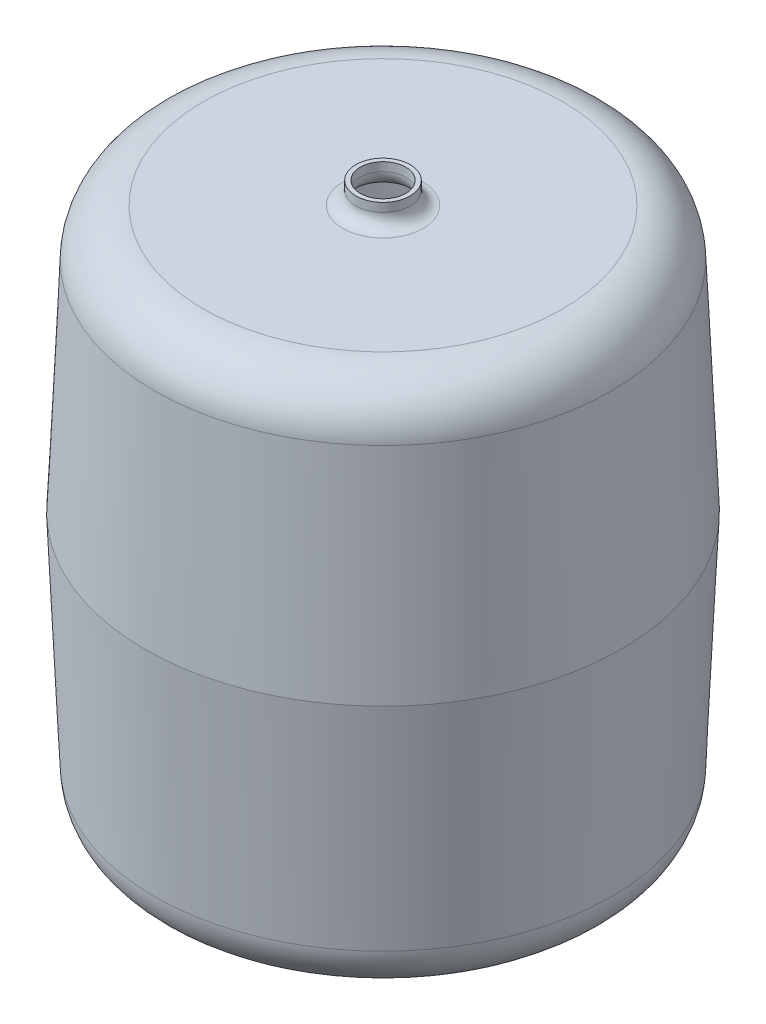
ISO-10303-21;
HEADER;
FILE_DESCRIPTION(('STEP AP214'),'2;1');
FILE_NAME('part.step','',(''),(''),'','','');
FILE_SCHEMA(('AUTOMOTIVE_DESIGN { 1 0 10303 214 1 1 1 1 }'));
ENDSEC;
DATA;
#1=APPLICATION_CONTEXT('core data for automotive mechanical design processes');
#2=APPLICATION_PROTOCOL_DEFINITION('international standard','automotive_design',2000,#1);
#3=PRODUCT_CONTEXT('',#1,'mechanical');
#4=PRODUCT('Part','Part','',(#3));
#5=PRODUCT_RELATED_PRODUCT_CATEGORY('part','',(#4));
#6=PRODUCT_DEFINITION_FORMATION('','',#4);
#7=PRODUCT_DEFINITION_CONTEXT('part definition',#1,'design');
#8=PRODUCT_DEFINITION('design','',#6,#7);
#9=PRODUCT_DEFINITION_SHAPE('','',#8);
#10=(LENGTH_UNIT() NAMED_UNIT(*) SI_UNIT(.MILLI.,.METRE.));
#11=(NAMED_UNIT(*) PLANE_ANGLE_UNIT() SI_UNIT($,.RADIAN.));
#12=(NAMED_UNIT(*) SI_UNIT($,.STERADIAN.) SOLID_ANGLE_UNIT());
#13=UNCERTAINTY_MEASURE_WITH_UNIT(LENGTH_MEASURE(1.E-05),#10,'distance_accuracy_value','');
#14=(GEOMETRIC_REPRESENTATION_CONTEXT(3) GLOBAL_UNCERTAINTY_ASSIGNED_CONTEXT((#13)) GLOBAL_UNIT_ASSIGNED_CONTEXT((#10,
#11,#12)) REPRESENTATION_CONTEXT('',''));
#15=CARTESIAN_POINT('',(0.,0.,0.));
#16=DIRECTION('',(0.,0.,1.));
#17=DIRECTION('',(1.,0.,0.));
#18=AXIS2_PLACEMENT_3D('',#15,#16,#17);
#19=CARTESIAN_POINT('',(1.13094262137405,254.067389771066,0.));
#20=DIRECTION('',(0.,-1.,0.));
#21=DIRECTION('',(0.,0.,-1.));
#22=AXIS2_PLACEMENT_3D('',#19,#20,#21);
#23=PLANE('',#22);
#24=CARTESIAN_POINT('',(26.1309426213741,254.067389771066,0.));
#25=DIRECTION('',(0.,-1.,0.));
#26=DIRECTION('',(0.,0.,-1.));
#27=AXIS2_PLACEMENT_3D('',#24,#25,#26);
#28=CIRCLE('',#27,21.);
#29=CARTESIAN_POINT('',(26.1309426213741,254.067389771066,-21.));
#30=VERTEX_POINT('',#29);
#31=EDGE_CURVE('E86',#30,#30,#28,.T.);
#32=ORIENTED_EDGE('',*,*,#31,.T.);
#33=EDGE_LOOP('',(#32));
#34=FACE_BOUND('',#33,.T.);
#35=CARTESIAN_POINT('',(26.1309426213741,254.067389771066,0.));
#36=DIRECTION('',(0.,-1.,0.));
#37=DIRECTION('',(0.,0.,-1.));
#38=AXIS2_PLACEMENT_3D('',#35,#36,#37);
#39=CIRCLE('',#38,25.);
#40=CARTESIAN_POINT('',(26.1309426213741,254.067389771066,-25.));
#41=VERTEX_POINT('',#40);
#42=EDGE_CURVE('E81',#41,#41,#39,.T.);
#43=ORIENTED_EDGE('',*,*,#42,.F.);
#44=EDGE_LOOP('',(#43));
#45=FACE_BOUND('',#44,.T.);
#46=ADVANCED_FACE('F45',(#34,#45),#23,.F.);
#47=CARTESIAN_POINT('',(-182.619057378626,-255.932610228934,0.));
#48=DIRECTION('',(0.,1.,0.));
#49=DIRECTION('',(0.,0.,1.));
#50=AXIS2_PLACEMENT_3D('',#47,#48,#49);
#51=PLANE('',#50);
#52=CARTESIAN_POINT('',(26.1309426213741,-255.932610228934,0.));
#53=DIRECTION('',(0.,1.,0.));
#54=DIRECTION('',(0.,0.,1.));
#55=AXIS2_PLACEMENT_3D('',#52,#53,#54);
#56=CIRCLE('',#55,165.671871598533);
#57=CARTESIAN_POINT('',(26.1309426213741,-255.932610228934,165.671871598533));
#58=VERTEX_POINT('',#57);
#59=EDGE_CURVE('E53',#58,#58,#56,.F.);
#60=ORIENTED_EDGE('',*,*,#59,.T.);
#61=EDGE_LOOP('',(#60));
#62=FACE_BOUND('',#61,.T.);
#63=ADVANCED_FACE('F134',(#62),#51,.F.);
#64=CARTESIAN_POINT('',(26.1309426213741,-10.9326102289342,0.));
#65=DIRECTION('',(0.,1.,0.));
#66=DIRECTION('',(0.,0.,1.));
#67=AXIS2_PLACEMENT_3D('',#64,#65,#66);
#68=CONICAL_SURFACE('',#67,219.446931012585,0.0436332312998548);
#69=CARTESIAN_POINT('',(26.1309426213741,-212.895482660374,0.));
#70=DIRECTION('',(0.,-1.,0.));
#71=DIRECTION('',(0.,0.,-1.));
#72=AXIS2_PLACEMENT_3D('',#69,#70,#71);
#73=CIRCLE('',#72,210.629041569717);
#74=CARTESIAN_POINT('',(26.1309426213741,-212.895482660374,-210.629041569717));
#75=VERTEX_POINT('',#74);
#76=EDGE_CURVE('E10',#75,#75,#73,.F.);
#77=ORIENTED_EDGE('',*,*,#76,.T.);
#78=EDGE_LOOP('',(#77));
#79=FACE_BOUND('',#78,.T.);
#80=CARTESIAN_POINT('',(26.1309426213741,-10.9326102289342,0.));
#81=DIRECTION('',(0.,-1.,0.));
#82=DIRECTION('',(0.,0.,-1.));
#83=AXIS2_PLACEMENT_3D('',#80,#81,#82);
#84=CIRCLE('',#83,219.446931012585);
#85=CARTESIAN_POINT('',(26.1309426213741,-10.9326102289342,-219.446931012585));
#86=VERTEX_POINT('',#85);
#87=EDGE_CURVE('E77',#86,#86,#84,.T.);
#88=ORIENTED_EDGE('',*,*,#87,.T.);
#89=EDGE_LOOP('',(#88));
#90=FACE_BOUND('',#89,.T.);
#91=ADVANCED_FACE('F140',(#79,#90),#68,.T.);
#92=CARTESIAN_POINT('',(26.1309426213741,234.067389771066,0.));
#93=DIRECTION('',(0.,-1.,0.));
#94=DIRECTION('',(0.,0.,-1.));
#95=AXIS2_PLACEMENT_3D('',#92,#93,#94);
#96=CONICAL_SURFACE('',#95,208.75,0.0436332312998542);
#97=CARTESIAN_POINT('',(26.1309426213741,191.030262202506,0.));
#98=DIRECTION('',(0.,1.,0.));
#99=DIRECTION('',(0.,0.,1.));
#100=AXIS2_PLACEMENT_3D('',#97,#98,#99);
#101=CIRCLE('',#100,210.629041569717);
#102=CARTESIAN_POINT('',(26.1309426213741,191.030262202506,210.629041569717));
#103=VERTEX_POINT('',#102);
#104=EDGE_CURVE('E63',#103,#103,#101,.F.);
#105=ORIENTED_EDGE('',*,*,#104,.T.);
#106=EDGE_LOOP('',(#105));
#107=FACE_BOUND('',#106,.T.);
#108=ORIENTED_EDGE('',*,*,#87,.F.);
#109=EDGE_LOOP('',(#108));
#110=FACE_BOUND('',#109,.T.);
#111=ADVANCED_FACE('F158',(#107,#110),#96,.T.);
#112=CARTESIAN_POINT('',(1.13094262137405,234.067389771066,0.));
#113=DIRECTION('',(0.,-1.,0.));
#114=DIRECTION('',(0.,0.,-1.));
#115=AXIS2_PLACEMENT_3D('',#112,#113,#114);
#116=PLANE('',#115);
#117=CARTESIAN_POINT('',(26.1309426213741,234.067389771066,0.));
#118=DIRECTION('',(0.,-1.,0.));
#119=DIRECTION('',(0.,0.,-1.));
#120=AXIS2_PLACEMENT_3D('',#117,#118,#119);
#121=CIRCLE('',#120,165.671871598534);
#122=CARTESIAN_POINT('',(26.1309426213741,234.067389771066,-165.671871598534));
#123=VERTEX_POINT('',#122);
#124=EDGE_CURVE('E58',#123,#123,#121,.F.);
#125=ORIENTED_EDGE('',*,*,#124,.T.);
#126=EDGE_LOOP('',(#125));
#127=FACE_BOUND('',#126,.T.);
#128=CARTESIAN_POINT('',(26.1309426213741,234.067389771066,0.));
#129=DIRECTION('',(0.,-1.,0.));
#130=DIRECTION('',(0.,0.,-1.));
#131=AXIS2_PLACEMENT_3D('',#128,#129,#130);
#132=CIRCLE('',#131,37.);
#133=CARTESIAN_POINT('',(26.1309426213741,234.067389771066,-37.));
#134=VERTEX_POINT('',#133);
#135=EDGE_CURVE('E73',#134,#134,#132,.T.);
#136=ORIENTED_EDGE('',*,*,#135,.T.);
#137=EDGE_LOOP('',(#136));
#138=FACE_BOUND('',#137,.T.);
#139=ADVANCED_FACE('F161',(#127,#138),#116,.F.);
#140=CARTESIAN_POINT('',(26.1309426213741,-255.932610228934,0.));
#141=DIRECTION('',(0.,-1.,0.));
#142=DIRECTION('',(0.,0.,-1.));
#143=AXIS2_PLACEMENT_3D('',#140,#141,#142);
#144=CYLINDRICAL_SURFACE('',#143,25.);
#145=CARTESIAN_POINT('',(26.1309426213741,246.067389771066,0.));
#146=DIRECTION('',(0.,-1.,0.));
#147=DIRECTION('',(0.,0.,-1.));
#148=AXIS2_PLACEMENT_3D('',#145,#146,#147);
#149=CIRCLE('',#148,25.);
#150=CARTESIAN_POINT('',(26.1309426213741,246.067389771066,-25.));
#151=VERTEX_POINT('',#150);
#152=EDGE_CURVE('E69',#151,#151,#149,.F.);
#153=ORIENTED_EDGE('',*,*,#152,.T.);
#154=EDGE_LOOP('',(#153));
#155=FACE_BOUND('',#154,.T.);
#156=ORIENTED_EDGE('',*,*,#42,.T.);
#157=EDGE_LOOP('',(#156));
#158=FACE_BOUND('',#157,.T.);
#159=ADVANCED_FACE('F147',(#155,#158),#144,.T.);
#160=CARTESIAN_POINT('',(26.1309426213741,246.067389771066,0.));
#161=DIRECTION('',(0.,-1.,0.));
#162=DIRECTION('',(0.,0.,-1.));
#163=AXIS2_PLACEMENT_3D('',#160,#161,#162);
#164=TOROIDAL_SURFACE('',#163,37.,12.);
#165=ORIENTED_EDGE('',*,*,#152,.F.);
#166=EDGE_LOOP('',(#165));
#167=FACE_BOUND('',#166,.T.);
#168=ORIENTED_EDGE('',*,*,#135,.F.);
#169=EDGE_LOOP('',(#168));
#170=FACE_BOUND('',#169,.T.);
#171=ADVANCED_FACE('F145',(#167,#170),#164,.F.);
#172=CARTESIAN_POINT('',(26.1309426213741,189.067389771066,0.));
#173=DIRECTION('',(0.,-1.,0.));
#174=DIRECTION('',(0.,0.,-1.));
#175=AXIS2_PLACEMENT_3D('',#172,#173,#174);
#176=TOROIDAL_SURFACE('',#175,165.671871598534,45.);
#177=ORIENTED_EDGE('',*,*,#124,.F.);
#178=EDGE_LOOP('',(#177));
#179=FACE_BOUND('',#178,.T.);
#180=ORIENTED_EDGE('',*,*,#104,.F.);
#181=EDGE_LOOP('',(#180));
#182=FACE_BOUND('',#181,.T.);
#183=ADVANCED_FACE('F132',(#179,#182),#176,.T.);
#184=CARTESIAN_POINT('',(26.1309426213741,-210.932610228934,0.));
#185=DIRECTION('',(0.,1.,0.));
#186=DIRECTION('',(0.,0.,1.));
#187=AXIS2_PLACEMENT_3D('',#184,#185,#186);
#188=TOROIDAL_SURFACE('',#187,165.671871598533,45.);
#189=ORIENTED_EDGE('',*,*,#76,.F.);
#190=EDGE_LOOP('',(#189));
#191=FACE_BOUND('',#190,.T.);
#192=ORIENTED_EDGE('',*,*,#59,.F.);
#193=EDGE_LOOP('',(#192));
#194=FACE_BOUND('',#193,.T.);
#195=ADVANCED_FACE('F47',(#191,#194),#188,.T.);
#196=CARTESIAN_POINT('',(-182.619057378626,-251.932610228934,0.));
#197=DIRECTION('',(0.,1.,0.));
#198=DIRECTION('',(0.,0.,1.));
#199=AXIS2_PLACEMENT_3D('',#196,#197,#198);
#200=PLANE('',#199);
#201=CARTESIAN_POINT('',(26.1309426213741,-251.932610228934,0.));
#202=DIRECTION('',(0.,1.,0.));
#203=DIRECTION('',(0.,0.,1.));
#204=AXIS2_PLACEMENT_3D('',#201,#202,#203);
#205=CIRCLE('',#204,165.671871598533);
#206=CARTESIAN_POINT('',(26.1309426213741,-251.932610228934,165.671871598533));
#207=VERTEX_POINT('',#206);
#208=EDGE_CURVE('E104',#207,#207,#205,.F.);
#209=ORIENTED_EDGE('',*,*,#208,.F.);
#210=EDGE_LOOP('',(#209));
#211=FACE_BOUND('',#210,.T.);
#212=ADVANCED_FACE('F120',(#211),#200,.T.);
#213=CARTESIAN_POINT('',(26.1309426213741,-10.7581326794729,0.));
#214=DIRECTION('',(0.,1.,0.));
#215=DIRECTION('',(0.,0.,1.));
#216=AXIS2_PLACEMENT_3D('',#213,#214,#215);
#217=CONICAL_SURFACE('',#216,215.450738126257,0.0436332312998548);
#218=CARTESIAN_POINT('',(26.1309426213741,-212.721005110913,0.));
#219=DIRECTION('',(0.,1.,0.));
#220=DIRECTION('',(0.,0.,1.));
#221=AXIS2_PLACEMENT_3D('',#218,#219,#220);
#222=CIRCLE('',#221,206.63284868339);
#223=CARTESIAN_POINT('',(26.1309426213741,-212.721005110913,206.63284868339));
#224=VERTEX_POINT('',#223);
#225=EDGE_CURVE('E85',#224,#224,#222,.T.);
#226=ORIENTED_EDGE('',*,*,#225,.F.);
#227=EDGE_LOOP('',(#226));
#228=FACE_BOUND('',#227,.T.);
#229=CARTESIAN_POINT('',(26.1309426213741,-10.9326102289344,0.));
#230=DIRECTION('',(0.,-1.,0.));
#231=DIRECTION('',(0.,0.,-1.));
#232=AXIS2_PLACEMENT_3D('',#229,#230,#231);
#233=CIRCLE('',#232,215.443120271931);
#234=CARTESIAN_POINT('',(26.1309426213741,-10.9326102289344,-215.443120271931));
#235=VERTEX_POINT('',#234);
#236=EDGE_CURVE('E90',#235,#235,#233,.T.);
#237=ORIENTED_EDGE('',*,*,#236,.F.);
#238=EDGE_LOOP('',(#237));
#239=FACE_BOUND('',#238,.T.);
#240=ADVANCED_FACE('F122',(#228,#239),#217,.F.);
#241=CARTESIAN_POINT('',(26.1309426213741,233.892912221604,0.));
#242=DIRECTION('',(0.,-1.,0.));
#243=DIRECTION('',(0.,0.,-1.));
#244=AXIS2_PLACEMENT_3D('',#241,#242,#243);
#245=CONICAL_SURFACE('',#244,204.753807113673,0.0436332312998542);
#246=CARTESIAN_POINT('',(26.1309426213741,190.855784653045,0.));
#247=DIRECTION('',(0.,-1.,0.));
#248=DIRECTION('',(0.,0.,-1.));
#249=AXIS2_PLACEMENT_3D('',#246,#247,#248);
#250=CIRCLE('',#249,206.63284868339);
#251=CARTESIAN_POINT('',(26.1309426213741,190.855784653045,-206.63284868339));
#252=VERTEX_POINT('',#251);
#253=EDGE_CURVE('E95',#252,#252,#250,.T.);
#254=ORIENTED_EDGE('',*,*,#253,.F.);
#255=EDGE_LOOP('',(#254));
#256=FACE_BOUND('',#255,.T.);
#257=ORIENTED_EDGE('',*,*,#236,.T.);
#258=EDGE_LOOP('',(#257));
#259=FACE_BOUND('',#258,.T.);
#260=ADVANCED_FACE('F128',(#256,#259),#245,.F.);
#261=CARTESIAN_POINT('',(1.13094262137405,230.067389771066,0.));
#262=DIRECTION('',(0.,-1.,0.));
#263=DIRECTION('',(0.,0.,-1.));
#264=AXIS2_PLACEMENT_3D('',#261,#262,#263);
#265=PLANE('',#264);
#266=CARTESIAN_POINT('',(26.1309426213741,230.067389771066,0.));
#267=DIRECTION('',(0.,-1.,0.));
#268=DIRECTION('',(0.,0.,-1.));
#269=AXIS2_PLACEMENT_3D('',#266,#267,#268);
#270=CIRCLE('',#269,165.671871598534);
#271=CARTESIAN_POINT('',(26.1309426213741,230.067389771066,-165.671871598534));
#272=VERTEX_POINT('',#271);
#273=EDGE_CURVE('E100',#272,#272,#270,.F.);
#274=ORIENTED_EDGE('',*,*,#273,.F.);
#275=EDGE_LOOP('',(#274));
#276=FACE_BOUND('',#275,.T.);
#277=CARTESIAN_POINT('',(26.1309426213741,230.067389771066,0.));
#278=DIRECTION('',(0.,-1.,0.));
#279=DIRECTION('',(0.,0.,-1.));
#280=AXIS2_PLACEMENT_3D('',#277,#278,#279);
#281=CIRCLE('',#280,37.);
#282=CARTESIAN_POINT('',(26.1309426213741,230.067389771066,-37.));
#283=VERTEX_POINT('',#282);
#284=EDGE_CURVE('E96',#283,#283,#281,.T.);
#285=ORIENTED_EDGE('',*,*,#284,.F.);
#286=EDGE_LOOP('',(#285));
#287=FACE_BOUND('',#286,.T.);
#288=ADVANCED_FACE('F188',(#276,#287),#265,.T.);
#289=CARTESIAN_POINT('',(26.1309426213741,-255.932610228934,0.));
#290=DIRECTION('',(0.,-1.,0.));
#291=DIRECTION('',(0.,0.,-1.));
#292=AXIS2_PLACEMENT_3D('',#289,#290,#291);
#293=CYLINDRICAL_SURFACE('',#292,21.);
#294=CARTESIAN_POINT('',(26.1309426213741,246.067389771066,0.));
#295=DIRECTION('',(0.,-1.,0.));
#296=DIRECTION('',(0.,0.,-1.));
#297=AXIS2_PLACEMENT_3D('',#294,#295,#296);
#298=CIRCLE('',#297,21.);
#299=CARTESIAN_POINT('',(26.1309426213741,246.067389771066,-21.));
#300=VERTEX_POINT('',#299);
#301=EDGE_CURVE('E91',#300,#300,#298,.F.);
#302=ORIENTED_EDGE('',*,*,#301,.F.);
#303=EDGE_LOOP('',(#302));
#304=FACE_BOUND('',#303,.T.);
#305=ORIENTED_EDGE('',*,*,#31,.F.);
#306=EDGE_LOOP('',(#305));
#307=FACE_BOUND('',#306,.T.);
#308=ADVANCED_FACE('F184',(#304,#307),#293,.F.);
#309=CARTESIAN_POINT('',(26.1309426213741,246.067389771066,0.));
#310=DIRECTION('',(0.,-1.,0.));
#311=DIRECTION('',(0.,0.,-1.));
#312=AXIS2_PLACEMENT_3D('',#309,#310,#311);
#313=TOROIDAL_SURFACE('',#312,37.,16.);
#314=ORIENTED_EDGE('',*,*,#301,.T.);
#315=EDGE_LOOP('',(#314));
#316=FACE_BOUND('',#315,.T.);
#317=ORIENTED_EDGE('',*,*,#284,.T.);
#318=EDGE_LOOP('',(#317));
#319=FACE_BOUND('',#318,.T.);
#320=ADVANCED_FACE('F180',(#316,#319),#313,.T.);
#321=CARTESIAN_POINT('',(26.1309426213741,189.067389771066,0.));
#322=DIRECTION('',(0.,-1.,0.));
#323=DIRECTION('',(0.,0.,-1.));
#324=AXIS2_PLACEMENT_3D('',#321,#322,#323);
#325=TOROIDAL_SURFACE('',#324,165.671871598534,41.);
#326=ORIENTED_EDGE('',*,*,#273,.T.);
#327=EDGE_LOOP('',(#326));
#328=FACE_BOUND('',#327,.T.);
#329=ORIENTED_EDGE('',*,*,#253,.T.);
#330=EDGE_LOOP('',(#329));
#331=FACE_BOUND('',#330,.T.);
#332=ADVANCED_FACE('F176',(#328,#331),#325,.F.);
#333=CARTESIAN_POINT('',(26.1309426213741,-210.932610228934,0.));
#334=DIRECTION('',(0.,1.,0.));
#335=DIRECTION('',(0.,0.,1.));
#336=AXIS2_PLACEMENT_3D('',#333,#334,#335);
#337=TOROIDAL_SURFACE('',#336,165.671871598533,41.);
#338=ORIENTED_EDGE('',*,*,#225,.T.);
#339=EDGE_LOOP('',(#338));
#340=FACE_BOUND('',#339,.T.);
#341=ORIENTED_EDGE('',*,*,#208,.T.);
#342=EDGE_LOOP('',(#341));
#343=FACE_BOUND('',#342,.T.);
#344=ADVANCED_FACE('F118',(#340,#343),#337,.F.);
#345=CLOSED_SHELL('',(#46,#63,#91,#111,#139,#159,#171,#183,#195,#212,#240,#260,#288,#308,#320,
#332,#344));
#346=MANIFOLD_SOLID_BREP('B2',#345);
#347=ADVANCED_BREP_SHAPE_REPRESENTATION('',(#18,#346),#14);
#348=SHAPE_DEFINITION_REPRESENTATION(#9,#347);
ENDSEC;
END-ISO-10303-21;
